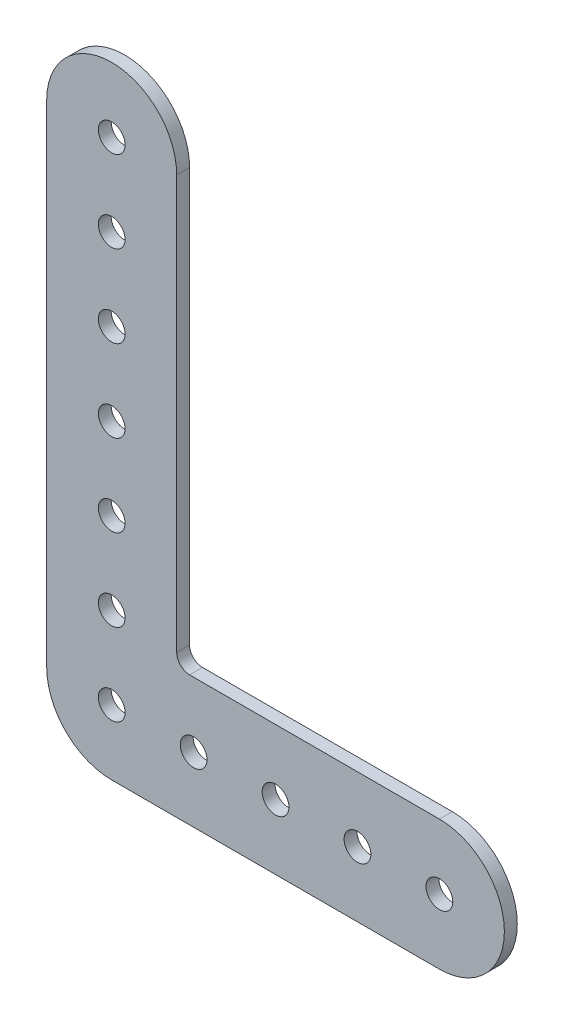
ISO-10303-21;
HEADER;
FILE_DESCRIPTION(('STEP AP214'),'2;1');
FILE_NAME('part.step','',(''),(''),'','','');
FILE_SCHEMA(('AUTOMOTIVE_DESIGN { 1 0 10303 214 1 1 1 1 }'));
ENDSEC;
DATA;
#1=APPLICATION_CONTEXT('core data for automotive mechanical design processes');
#2=APPLICATION_PROTOCOL_DEFINITION('international standard','automotive_design',2000,#1);
#3=PRODUCT_CONTEXT('',#1,'mechanical');
#4=PRODUCT('Part','Part','',(#3));
#5=PRODUCT_RELATED_PRODUCT_CATEGORY('part','',(#4));
#6=PRODUCT_DEFINITION_FORMATION('','',#4);
#7=PRODUCT_DEFINITION_CONTEXT('part definition',#1,'design');
#8=PRODUCT_DEFINITION('design','',#6,#7);
#9=PRODUCT_DEFINITION_SHAPE('','',#8);
#10=(LENGTH_UNIT() NAMED_UNIT(*) SI_UNIT(.MILLI.,.METRE.));
#11=(NAMED_UNIT(*) PLANE_ANGLE_UNIT() SI_UNIT($,.RADIAN.));
#12=(NAMED_UNIT(*) SI_UNIT($,.STERADIAN.) SOLID_ANGLE_UNIT());
#13=UNCERTAINTY_MEASURE_WITH_UNIT(LENGTH_MEASURE(1.E-05),#10,'distance_accuracy_value','');
#14=(GEOMETRIC_REPRESENTATION_CONTEXT(3) GLOBAL_UNCERTAINTY_ASSIGNED_CONTEXT((#13)) GLOBAL_UNIT_ASSIGNED_CONTEXT((#10,
#11,#12)) REPRESENTATION_CONTEXT('',''));
#15=CARTESIAN_POINT('',(0.,0.,0.));
#16=DIRECTION('',(0.,0.,1.));
#17=DIRECTION('',(1.,0.,0.));
#18=AXIS2_PLACEMENT_3D('',#15,#16,#17);
#19=CARTESIAN_POINT('',(-2.61384973715095E-13,76.2,1.));
#20=DIRECTION('',(0.,0.,1.));
#21=DIRECTION('',(1.,0.,0.));
#22=AXIS2_PLACEMENT_3D('',#19,#20,#21);
#23=PLANE('',#22);
#24=CARTESIAN_POINT('',(-2.17820811429246E-13,63.5,1.));
#25=DIRECTION('',(0.,0.,1.));
#26=DIRECTION('',(1.,0.,0.));
#27=AXIS2_PLACEMENT_3D('',#24,#25,#26);
#28=CIRCLE('',#27,2.075);
#29=CARTESIAN_POINT('',(2.07499999999978,63.5,1.));
#30=VERTEX_POINT('',#29);
#31=EDGE_CURVE('E216',#30,#30,#28,.T.);
#32=ORIENTED_EDGE('',*,*,#31,.F.);
#33=EDGE_LOOP('',(#32));
#34=FACE_BOUND('',#33,.T.);
#35=CARTESIAN_POINT('',(-1.30692486857548E-13,38.1,1.));
#36=DIRECTION('',(0.,0.,1.));
#37=DIRECTION('',(1.,0.,0.));
#38=AXIS2_PLACEMENT_3D('',#35,#36,#37);
#39=CIRCLE('',#38,2.075);
#40=CARTESIAN_POINT('',(2.07499999999987,38.1,1.));
#41=VERTEX_POINT('',#40);
#42=EDGE_CURVE('E204',#41,#41,#39,.T.);
#43=ORIENTED_EDGE('',*,*,#42,.F.);
#44=EDGE_LOOP('',(#43));
#45=FACE_BOUND('',#44,.T.);
#46=CARTESIAN_POINT('',(0.,12.7,1.));
#47=DIRECTION('',(0.,0.,1.));
#48=DIRECTION('',(1.,0.,0.));
#49=AXIS2_PLACEMENT_3D('',#46,#47,#48);
#50=CIRCLE('',#49,2.075);
#51=CARTESIAN_POINT('',(2.07499999999996,12.7,1.));
#52=VERTEX_POINT('',#51);
#53=EDGE_CURVE('E192',#52,#52,#50,.T.);
#54=ORIENTED_EDGE('',*,*,#53,.F.);
#55=EDGE_LOOP('',(#54));
#56=FACE_BOUND('',#55,.T.);
#57=CARTESIAN_POINT('',(38.1,0.,1.));
#58=DIRECTION('',(0.,0.,1.));
#59=DIRECTION('',(1.,0.,0.));
#60=AXIS2_PLACEMENT_3D('',#57,#58,#59);
#61=CIRCLE('',#60,2.075);
#62=CARTESIAN_POINT('',(40.175,0.,1.));
#63=VERTEX_POINT('',#62);
#64=EDGE_CURVE('E180',#63,#63,#61,.T.);
#65=ORIENTED_EDGE('',*,*,#64,.F.);
#66=EDGE_LOOP('',(#65));
#67=FACE_BOUND('',#66,.T.);
#68=CARTESIAN_POINT('',(12.7,0.,1.));
#69=DIRECTION('',(0.,0.,1.));
#70=DIRECTION('',(1.,0.,0.));
#71=AXIS2_PLACEMENT_3D('',#68,#69,#70);
#72=CIRCLE('',#71,2.075);
#73=CARTESIAN_POINT('',(14.775,0.,1.));
#74=VERTEX_POINT('',#73);
#75=EDGE_CURVE('E168',#74,#74,#72,.T.);
#76=ORIENTED_EDGE('',*,*,#75,.F.);
#77=EDGE_LOOP('',(#76));
#78=FACE_BOUND('',#77,.T.);
#79=CARTESIAN_POINT('',(-2.61384973715095E-13,76.2,1.));
#80=DIRECTION('',(0.,0.,1.));
#81=DIRECTION('',(1.,0.,0.));
#82=AXIS2_PLACEMENT_3D('',#79,#80,#81);
#83=CIRCLE('',#82,10.075);
#84=CARTESIAN_POINT('',(10.0749999999997,76.2,1.));
#85=VERTEX_POINT('',#84);
#86=CARTESIAN_POINT('',(-10.0750000000003,76.2,1.));
#87=VERTEX_POINT('',#86);
#88=EDGE_CURVE('E112',#85,#87,#83,.T.);
#89=ORIENTED_EDGE('',*,*,#88,.T.);
#90=DIRECTION('',(0.,-1.,0.));
#91=VECTOR('',#90,1.);
#92=CARTESIAN_POINT('',(-10.0750000000003,76.2,1.));
#93=LINE('',#92,#91);
#94=CARTESIAN_POINT('',(-10.075,0.,1.));
#95=VERTEX_POINT('',#94);
#96=EDGE_CURVE('E101',#87,#95,#93,.T.);
#97=ORIENTED_EDGE('',*,*,#96,.T.);
#98=CARTESIAN_POINT('',(0.,0.,1.));
#99=DIRECTION('',(0.,0.,1.));
#100=DIRECTION('',(1.,0.,0.));
#101=AXIS2_PLACEMENT_3D('',#98,#99,#100);
#102=CIRCLE('',#101,10.075);
#103=CARTESIAN_POINT('',(0.,-10.075,1.));
#104=VERTEX_POINT('',#103);
#105=EDGE_CURVE('E111',#95,#104,#102,.T.);
#106=ORIENTED_EDGE('',*,*,#105,.T.);
#107=DIRECTION('',(1.,0.,0.));
#108=VECTOR('',#107,1.);
#109=CARTESIAN_POINT('',(0.,-10.075,1.));
#110=LINE('',#109,#108);
#111=CARTESIAN_POINT('',(50.8,-10.075,1.));
#112=VERTEX_POINT('',#111);
#113=EDGE_CURVE('E162',#104,#112,#110,.T.);
#114=ORIENTED_EDGE('',*,*,#113,.T.);
#115=CARTESIAN_POINT('',(50.8,0.,1.));
#116=DIRECTION('',(0.,0.,1.));
#117=DIRECTION('',(1.,0.,0.));
#118=AXIS2_PLACEMENT_3D('',#115,#116,#117);
#119=CIRCLE('',#118,10.075);
#120=CARTESIAN_POINT('',(50.8,10.075,1.));
#121=VERTEX_POINT('',#120);
#122=EDGE_CURVE('E160',#112,#121,#119,.T.);
#123=ORIENTED_EDGE('',*,*,#122,.T.);
#124=DIRECTION('',(-1.,0.,0.));
#125=VECTOR('',#124,1.);
#126=CARTESIAN_POINT('',(50.8,10.075,1.));
#127=LINE('',#126,#125);
#128=CARTESIAN_POINT('',(12.075,10.075,1.));
#129=VERTEX_POINT('',#128);
#130=EDGE_CURVE('E158',#121,#129,#127,.T.);
#131=ORIENTED_EDGE('',*,*,#130,.T.);
#132=CARTESIAN_POINT('',(12.075,12.075,1.));
#133=DIRECTION('',(0.,0.,1.));
#134=DIRECTION('',(1.,0.,0.));
#135=AXIS2_PLACEMENT_3D('',#132,#133,#134);
#136=CIRCLE('',#135,2.);
#137=CARTESIAN_POINT('',(10.075,12.075,1.));
#138=VERTEX_POINT('',#137);
#139=EDGE_CURVE('E11',#129,#138,#136,.F.);
#140=ORIENTED_EDGE('',*,*,#139,.T.);
#141=DIRECTION('',(0.,1.,0.));
#142=VECTOR('',#141,1.);
#143=CARTESIAN_POINT('',(10.0749999999997,76.2,1.));
#144=LINE('',#143,#142);
#145=EDGE_CURVE('E117',#138,#85,#144,.T.);
#146=ORIENTED_EDGE('',*,*,#145,.T.);
#147=EDGE_LOOP('',(#89,#97,#106,#114,#123,#131,#140,#146));
#148=FACE_BOUND('',#147,.T.);
#149=CARTESIAN_POINT('',(0.,0.,1.));
#150=DIRECTION('',(0.,0.,1.));
#151=DIRECTION('',(1.,0.,0.));
#152=AXIS2_PLACEMENT_3D('',#149,#150,#151);
#153=CIRCLE('',#152,2.075);
#154=CARTESIAN_POINT('',(2.075,0.,1.));
#155=VERTEX_POINT('',#154);
#156=EDGE_CURVE('E156',#155,#155,#153,.T.);
#157=ORIENTED_EDGE('',*,*,#156,.F.);
#158=EDGE_LOOP('',(#157));
#159=FACE_BOUND('',#158,.T.);
#160=CARTESIAN_POINT('',(25.4,0.,1.));
#161=DIRECTION('',(0.,0.,1.));
#162=DIRECTION('',(1.,0.,0.));
#163=AXIS2_PLACEMENT_3D('',#160,#161,#162);
#164=CIRCLE('',#163,2.075);
#165=CARTESIAN_POINT('',(27.475,0.,1.));
#166=VERTEX_POINT('',#165);
#167=EDGE_CURVE('E174',#166,#166,#164,.T.);
#168=ORIENTED_EDGE('',*,*,#167,.F.);
#169=EDGE_LOOP('',(#168));
#170=FACE_BOUND('',#169,.T.);
#171=CARTESIAN_POINT('',(50.8,0.,1.));
#172=DIRECTION('',(0.,0.,1.));
#173=DIRECTION('',(1.,0.,0.));
#174=AXIS2_PLACEMENT_3D('',#171,#172,#173);
#175=CIRCLE('',#174,2.075);
#176=CARTESIAN_POINT('',(52.875,0.,1.));
#177=VERTEX_POINT('',#176);
#178=EDGE_CURVE('E186',#177,#177,#175,.T.);
#179=ORIENTED_EDGE('',*,*,#178,.F.);
#180=EDGE_LOOP('',(#179));
#181=FACE_BOUND('',#180,.T.);
#182=CARTESIAN_POINT('',(0.,25.4,1.));
#183=DIRECTION('',(0.,0.,1.));
#184=DIRECTION('',(1.,0.,0.));
#185=AXIS2_PLACEMENT_3D('',#182,#183,#184);
#186=CIRCLE('',#185,2.075);
#187=CARTESIAN_POINT('',(2.07499999999991,25.4,1.));
#188=VERTEX_POINT('',#187);
#189=EDGE_CURVE('E198',#188,#188,#186,.T.);
#190=ORIENTED_EDGE('',*,*,#189,.F.);
#191=EDGE_LOOP('',(#190));
#192=FACE_BOUND('',#191,.T.);
#193=CARTESIAN_POINT('',(-1.74256649143397E-13,50.8,1.));
#194=DIRECTION('',(0.,0.,1.));
#195=DIRECTION('',(1.,0.,0.));
#196=AXIS2_PLACEMENT_3D('',#193,#194,#195);
#197=CIRCLE('',#196,2.075);
#198=CARTESIAN_POINT('',(2.07499999999983,50.8,1.));
#199=VERTEX_POINT('',#198);
#200=EDGE_CURVE('E210',#199,#199,#197,.T.);
#201=ORIENTED_EDGE('',*,*,#200,.F.);
#202=EDGE_LOOP('',(#201));
#203=FACE_BOUND('',#202,.T.);
#204=CARTESIAN_POINT('',(-2.61384973715095E-13,76.2,1.));
#205=DIRECTION('',(0.,0.,1.));
#206=DIRECTION('',(1.,0.,0.));
#207=AXIS2_PLACEMENT_3D('',#204,#205,#206);
#208=CIRCLE('',#207,2.075);
#209=CARTESIAN_POINT('',(2.07499999999974,76.2,1.));
#210=VERTEX_POINT('',#209);
#211=EDGE_CURVE('E222',#210,#210,#208,.T.);
#212=ORIENTED_EDGE('',*,*,#211,.F.);
#213=EDGE_LOOP('',(#212));
#214=FACE_BOUND('',#213,.T.);
#215=ADVANCED_FACE('F36',(#34,#45,#56,#67,#78,#148,#159,#170,#181,#192,#203,#214),#23,.T.);
#216=CARTESIAN_POINT('',(-2.61384973715095E-13,76.2,-1.));
#217=DIRECTION('',(0.,0.,1.));
#218=DIRECTION('',(1.,0.,0.));
#219=AXIS2_PLACEMENT_3D('',#216,#217,#218);
#220=PLANE('',#219);
#221=CARTESIAN_POINT('',(-2.61384973715095E-13,76.2,-1.));
#222=DIRECTION('',(0.,0.,1.));
#223=DIRECTION('',(1.,0.,0.));
#224=AXIS2_PLACEMENT_3D('',#221,#222,#223);
#225=CIRCLE('',#224,10.075);
#226=CARTESIAN_POINT('',(10.0749999999997,76.2,-1.));
#227=VERTEX_POINT('',#226);
#228=CARTESIAN_POINT('',(-10.0750000000003,76.2,-1.));
#229=VERTEX_POINT('',#228);
#230=EDGE_CURVE('E125',#227,#229,#225,.T.);
#231=ORIENTED_EDGE('',*,*,#230,.F.);
#232=DIRECTION('',(0.,1.,0.));
#233=VECTOR('',#232,1.);
#234=CARTESIAN_POINT('',(10.0749999999997,76.2,-1.));
#235=LINE('',#234,#233);
#236=CARTESIAN_POINT('',(10.075,12.075,-1.));
#237=VERTEX_POINT('',#236);
#238=EDGE_CURVE('E121',#237,#227,#235,.T.);
#239=ORIENTED_EDGE('',*,*,#238,.F.);
#240=CARTESIAN_POINT('',(12.075,12.075,-1.));
#241=DIRECTION('',(0.,0.,1.));
#242=DIRECTION('',(1.,0.,0.));
#243=AXIS2_PLACEMENT_3D('',#240,#241,#242);
#244=CIRCLE('',#243,2.);
#245=CARTESIAN_POINT('',(12.075,10.075,-1.));
#246=VERTEX_POINT('',#245);
#247=EDGE_CURVE('E44',#237,#246,#244,.T.);
#248=ORIENTED_EDGE('',*,*,#247,.T.);
#249=DIRECTION('',(-1.,0.,0.));
#250=VECTOR('',#249,1.);
#251=CARTESIAN_POINT('',(50.8,10.075,-1.));
#252=LINE('',#251,#250);
#253=CARTESIAN_POINT('',(50.8,10.075,-1.));
#254=VERTEX_POINT('',#253);
#255=EDGE_CURVE('E145',#254,#246,#252,.T.);
#256=ORIENTED_EDGE('',*,*,#255,.F.);
#257=CARTESIAN_POINT('',(50.8,0.,-1.));
#258=DIRECTION('',(0.,0.,1.));
#259=DIRECTION('',(1.,0.,0.));
#260=AXIS2_PLACEMENT_3D('',#257,#258,#259);
#261=CIRCLE('',#260,10.075);
#262=CARTESIAN_POINT('',(50.8,-10.075,-1.));
#263=VERTEX_POINT('',#262);
#264=EDGE_CURVE('E147',#263,#254,#261,.T.);
#265=ORIENTED_EDGE('',*,*,#264,.F.);
#266=DIRECTION('',(1.,0.,0.));
#267=VECTOR('',#266,1.);
#268=CARTESIAN_POINT('',(0.,-10.075,-1.));
#269=LINE('',#268,#267);
#270=CARTESIAN_POINT('',(0.,-10.075,-1.));
#271=VERTEX_POINT('',#270);
#272=EDGE_CURVE('E149',#271,#263,#269,.T.);
#273=ORIENTED_EDGE('',*,*,#272,.F.);
#274=CARTESIAN_POINT('',(0.,0.,-1.));
#275=DIRECTION('',(0.,0.,1.));
#276=DIRECTION('',(1.,0.,0.));
#277=AXIS2_PLACEMENT_3D('',#274,#275,#276);
#278=CIRCLE('',#277,10.075);
#279=CARTESIAN_POINT('',(-10.075,0.,-1.));
#280=VERTEX_POINT('',#279);
#281=EDGE_CURVE('E151',#280,#271,#278,.T.);
#282=ORIENTED_EDGE('',*,*,#281,.F.);
#283=DIRECTION('',(0.,-1.,0.));
#284=VECTOR('',#283,1.);
#285=CARTESIAN_POINT('',(-10.0750000000003,76.2,-1.));
#286=LINE('',#285,#284);
#287=EDGE_CURVE('E153',#229,#280,#286,.T.);
#288=ORIENTED_EDGE('',*,*,#287,.F.);
#289=EDGE_LOOP('',(#231,#239,#248,#256,#265,#273,#282,#288));
#290=FACE_BOUND('',#289,.T.);
#291=CARTESIAN_POINT('',(0.,0.,-1.));
#292=DIRECTION('',(0.,0.,1.));
#293=DIRECTION('',(1.,0.,0.));
#294=AXIS2_PLACEMENT_3D('',#291,#292,#293);
#295=CIRCLE('',#294,2.075);
#296=CARTESIAN_POINT('',(2.075,0.,-1.));
#297=VERTEX_POINT('',#296);
#298=EDGE_CURVE('E165',#297,#297,#295,.T.);
#299=ORIENTED_EDGE('',*,*,#298,.T.);
#300=EDGE_LOOP('',(#299));
#301=FACE_BOUND('',#300,.T.);
#302=CARTESIAN_POINT('',(12.7,0.,-1.));
#303=DIRECTION('',(0.,0.,1.));
#304=DIRECTION('',(1.,0.,0.));
#305=AXIS2_PLACEMENT_3D('',#302,#303,#304);
#306=CIRCLE('',#305,2.075);
#307=CARTESIAN_POINT('',(14.775,0.,-1.));
#308=VERTEX_POINT('',#307);
#309=EDGE_CURVE('E171',#308,#308,#306,.T.);
#310=ORIENTED_EDGE('',*,*,#309,.T.);
#311=EDGE_LOOP('',(#310));
#312=FACE_BOUND('',#311,.T.);
#313=CARTESIAN_POINT('',(25.4,0.,-1.));
#314=DIRECTION('',(0.,0.,1.));
#315=DIRECTION('',(1.,0.,0.));
#316=AXIS2_PLACEMENT_3D('',#313,#314,#315);
#317=CIRCLE('',#316,2.075);
#318=CARTESIAN_POINT('',(27.475,0.,-1.));
#319=VERTEX_POINT('',#318);
#320=EDGE_CURVE('E177',#319,#319,#317,.T.);
#321=ORIENTED_EDGE('',*,*,#320,.T.);
#322=EDGE_LOOP('',(#321));
#323=FACE_BOUND('',#322,.T.);
#324=CARTESIAN_POINT('',(38.1,0.,-1.));
#325=DIRECTION('',(0.,0.,1.));
#326=DIRECTION('',(1.,0.,0.));
#327=AXIS2_PLACEMENT_3D('',#324,#325,#326);
#328=CIRCLE('',#327,2.075);
#329=CARTESIAN_POINT('',(40.175,0.,-1.));
#330=VERTEX_POINT('',#329);
#331=EDGE_CURVE('E183',#330,#330,#328,.T.);
#332=ORIENTED_EDGE('',*,*,#331,.T.);
#333=EDGE_LOOP('',(#332));
#334=FACE_BOUND('',#333,.T.);
#335=CARTESIAN_POINT('',(50.8,0.,-1.));
#336=DIRECTION('',(0.,0.,1.));
#337=DIRECTION('',(1.,0.,0.));
#338=AXIS2_PLACEMENT_3D('',#335,#336,#337);
#339=CIRCLE('',#338,2.075);
#340=CARTESIAN_POINT('',(52.875,0.,-1.));
#341=VERTEX_POINT('',#340);
#342=EDGE_CURVE('E189',#341,#341,#339,.T.);
#343=ORIENTED_EDGE('',*,*,#342,.T.);
#344=EDGE_LOOP('',(#343));
#345=FACE_BOUND('',#344,.T.);
#346=CARTESIAN_POINT('',(0.,12.7,-1.));
#347=DIRECTION('',(0.,0.,1.));
#348=DIRECTION('',(1.,0.,0.));
#349=AXIS2_PLACEMENT_3D('',#346,#347,#348);
#350=CIRCLE('',#349,2.075);
#351=CARTESIAN_POINT('',(2.07499999999996,12.7,-1.));
#352=VERTEX_POINT('',#351);
#353=EDGE_CURVE('E195',#352,#352,#350,.T.);
#354=ORIENTED_EDGE('',*,*,#353,.T.);
#355=EDGE_LOOP('',(#354));
#356=FACE_BOUND('',#355,.T.);
#357=CARTESIAN_POINT('',(0.,25.4,-1.));
#358=DIRECTION('',(0.,0.,1.));
#359=DIRECTION('',(1.,0.,0.));
#360=AXIS2_PLACEMENT_3D('',#357,#358,#359);
#361=CIRCLE('',#360,2.075);
#362=CARTESIAN_POINT('',(2.07499999999991,25.4,-1.));
#363=VERTEX_POINT('',#362);
#364=EDGE_CURVE('E201',#363,#363,#361,.T.);
#365=ORIENTED_EDGE('',*,*,#364,.T.);
#366=EDGE_LOOP('',(#365));
#367=FACE_BOUND('',#366,.T.);
#368=CARTESIAN_POINT('',(-1.30692486857548E-13,38.1,-1.));
#369=DIRECTION('',(0.,0.,1.));
#370=DIRECTION('',(1.,0.,0.));
#371=AXIS2_PLACEMENT_3D('',#368,#369,#370);
#372=CIRCLE('',#371,2.075);
#373=CARTESIAN_POINT('',(2.07499999999987,38.1,-1.));
#374=VERTEX_POINT('',#373);
#375=EDGE_CURVE('E207',#374,#374,#372,.T.);
#376=ORIENTED_EDGE('',*,*,#375,.T.);
#377=EDGE_LOOP('',(#376));
#378=FACE_BOUND('',#377,.T.);
#379=CARTESIAN_POINT('',(-1.74256649143397E-13,50.8,-1.));
#380=DIRECTION('',(0.,0.,1.));
#381=DIRECTION('',(1.,0.,0.));
#382=AXIS2_PLACEMENT_3D('',#379,#380,#381);
#383=CIRCLE('',#382,2.075);
#384=CARTESIAN_POINT('',(2.07499999999983,50.8,-1.));
#385=VERTEX_POINT('',#384);
#386=EDGE_CURVE('E213',#385,#385,#383,.T.);
#387=ORIENTED_EDGE('',*,*,#386,.T.);
#388=EDGE_LOOP('',(#387));
#389=FACE_BOUND('',#388,.T.);
#390=CARTESIAN_POINT('',(-2.17820811429246E-13,63.5,-1.));
#391=DIRECTION('',(0.,0.,1.));
#392=DIRECTION('',(1.,0.,0.));
#393=AXIS2_PLACEMENT_3D('',#390,#391,#392);
#394=CIRCLE('',#393,2.075);
#395=CARTESIAN_POINT('',(2.07499999999978,63.5,-1.));
#396=VERTEX_POINT('',#395);
#397=EDGE_CURVE('E219',#396,#396,#394,.T.);
#398=ORIENTED_EDGE('',*,*,#397,.T.);
#399=EDGE_LOOP('',(#398));
#400=FACE_BOUND('',#399,.T.);
#401=CARTESIAN_POINT('',(-2.61384973715095E-13,76.2,-1.));
#402=DIRECTION('',(0.,0.,1.));
#403=DIRECTION('',(1.,0.,0.));
#404=AXIS2_PLACEMENT_3D('',#401,#402,#403);
#405=CIRCLE('',#404,2.075);
#406=CARTESIAN_POINT('',(2.07499999999974,76.2,-1.));
#407=VERTEX_POINT('',#406);
#408=EDGE_CURVE('E225',#407,#407,#405,.T.);
#409=ORIENTED_EDGE('',*,*,#408,.T.);
#410=EDGE_LOOP('',(#409));
#411=FACE_BOUND('',#410,.T.);
#412=ADVANCED_FACE('F235',(#290,#301,#312,#323,#334,#345,#356,#367,#378,#389,#400,#411),#220,.F.);
#413=CARTESIAN_POINT('',(-2.61384973715095E-13,76.2,1.));
#414=DIRECTION('',(0.,0.,-1.));
#415=DIRECTION('',(-1.,0.,0.));
#416=AXIS2_PLACEMENT_3D('',#413,#414,#415);
#417=CYLINDRICAL_SURFACE('',#416,10.075);
#418=ORIENTED_EDGE('',*,*,#230,.T.);
#419=DIRECTION('',(0.,0.,-1.));
#420=VECTOR('',#419,1.);
#421=CARTESIAN_POINT('',(-10.0750000000003,76.2,1.));
#422=LINE('',#421,#420);
#423=EDGE_CURVE('E105',#87,#229,#422,.T.);
#424=ORIENTED_EDGE('',*,*,#423,.F.);
#425=ORIENTED_EDGE('',*,*,#88,.F.);
#426=DIRECTION('',(0.,0.,-1.));
#427=VECTOR('',#426,1.);
#428=CARTESIAN_POINT('',(10.0749999999997,76.2,1.));
#429=LINE('',#428,#427);
#430=EDGE_CURVE('E142',#85,#227,#429,.T.);
#431=ORIENTED_EDGE('',*,*,#430,.T.);
#432=EDGE_LOOP('',(#418,#424,#425,#431));
#433=FACE_BOUND('',#432,.T.);
#434=ADVANCED_FACE('F123',(#433),#417,.T.);
#435=CARTESIAN_POINT('',(-10.0750000000003,76.2,1.));
#436=DIRECTION('',(1.,0.,0.));
#437=DIRECTION('',(0.,1.,0.));
#438=AXIS2_PLACEMENT_3D('',#435,#436,#437);
#439=PLANE('',#438);
#440=ORIENTED_EDGE('',*,*,#287,.T.);
#441=DIRECTION('',(0.,0.,-1.));
#442=VECTOR('',#441,1.);
#443=CARTESIAN_POINT('',(-10.075,0.,1.));
#444=LINE('',#443,#442);
#445=EDGE_CURVE('E108',#95,#280,#444,.T.);
#446=ORIENTED_EDGE('',*,*,#445,.F.);
#447=ORIENTED_EDGE('',*,*,#96,.F.);
#448=ORIENTED_EDGE('',*,*,#423,.T.);
#449=EDGE_LOOP('',(#440,#446,#447,#448));
#450=FACE_BOUND('',#449,.T.);
#451=ADVANCED_FACE('F103',(#450),#439,.F.);
#452=CARTESIAN_POINT('',(0.,0.,1.));
#453=DIRECTION('',(0.,0.,-1.));
#454=DIRECTION('',(-1.,0.,0.));
#455=AXIS2_PLACEMENT_3D('',#452,#453,#454);
#456=CYLINDRICAL_SURFACE('',#455,10.075);
#457=ORIENTED_EDGE('',*,*,#281,.T.);
#458=DIRECTION('',(0.,0.,-1.));
#459=VECTOR('',#458,1.);
#460=CARTESIAN_POINT('',(0.,-10.075,1.));
#461=LINE('',#460,#459);
#462=EDGE_CURVE('E130',#104,#271,#461,.T.);
#463=ORIENTED_EDGE('',*,*,#462,.F.);
#464=ORIENTED_EDGE('',*,*,#105,.F.);
#465=ORIENTED_EDGE('',*,*,#445,.T.);
#466=EDGE_LOOP('',(#457,#463,#464,#465));
#467=FACE_BOUND('',#466,.T.);
#468=ADVANCED_FACE('F262',(#467),#456,.T.);
#469=CARTESIAN_POINT('',(0.,-10.075,1.));
#470=DIRECTION('',(0.,1.,0.));
#471=DIRECTION('',(0.,0.,1.));
#472=AXIS2_PLACEMENT_3D('',#469,#470,#471);
#473=PLANE('',#472);
#474=ORIENTED_EDGE('',*,*,#272,.T.);
#475=DIRECTION('',(0.,0.,-1.));
#476=VECTOR('',#475,1.);
#477=CARTESIAN_POINT('',(50.8,-10.075,1.));
#478=LINE('',#477,#476);
#479=EDGE_CURVE('E136',#112,#263,#478,.T.);
#480=ORIENTED_EDGE('',*,*,#479,.F.);
#481=ORIENTED_EDGE('',*,*,#113,.F.);
#482=ORIENTED_EDGE('',*,*,#462,.T.);
#483=EDGE_LOOP('',(#474,#480,#481,#482));
#484=FACE_BOUND('',#483,.T.);
#485=ADVANCED_FACE('F258',(#484),#473,.F.);
#486=CARTESIAN_POINT('',(50.8,0.,1.));
#487=DIRECTION('',(0.,0.,-1.));
#488=DIRECTION('',(-1.,0.,0.));
#489=AXIS2_PLACEMENT_3D('',#486,#487,#488);
#490=CYLINDRICAL_SURFACE('',#489,10.075);
#491=ORIENTED_EDGE('',*,*,#264,.T.);
#492=DIRECTION('',(0.,0.,-1.));
#493=VECTOR('',#492,1.);
#494=CARTESIAN_POINT('',(50.8,10.075,1.));
#495=LINE('',#494,#493);
#496=EDGE_CURVE('E139',#121,#254,#495,.T.);
#497=ORIENTED_EDGE('',*,*,#496,.F.);
#498=ORIENTED_EDGE('',*,*,#122,.F.);
#499=ORIENTED_EDGE('',*,*,#479,.T.);
#500=EDGE_LOOP('',(#491,#497,#498,#499));
#501=FACE_BOUND('',#500,.T.);
#502=ADVANCED_FACE('F255',(#501),#490,.T.);
#503=CARTESIAN_POINT('',(50.8,10.075,1.));
#504=DIRECTION('',(0.,-1.,0.));
#505=DIRECTION('',(0.,0.,-1.));
#506=AXIS2_PLACEMENT_3D('',#503,#504,#505);
#507=PLANE('',#506);
#508=ORIENTED_EDGE('',*,*,#255,.T.);
#509=DIRECTION('',(0.,0.,-1.));
#510=VECTOR('',#509,1.);
#511=CARTESIAN_POINT('',(12.075,10.075,1.));
#512=LINE('',#511,#510);
#513=EDGE_CURVE('E51',#246,#129,#512,.F.);
#514=ORIENTED_EDGE('',*,*,#513,.T.);
#515=ORIENTED_EDGE('',*,*,#130,.F.);
#516=ORIENTED_EDGE('',*,*,#496,.T.);
#517=EDGE_LOOP('',(#508,#514,#515,#516));
#518=FACE_BOUND('',#517,.T.);
#519=ADVANCED_FACE('F251',(#518),#507,.F.);
#520=CARTESIAN_POINT('',(10.0749999999997,76.2,1.));
#521=DIRECTION('',(-1.,0.,0.));
#522=DIRECTION('',(0.,-1.,0.));
#523=AXIS2_PLACEMENT_3D('',#520,#521,#522);
#524=PLANE('',#523);
#525=ORIENTED_EDGE('',*,*,#145,.F.);
#526=DIRECTION('',(0.,0.,-1.));
#527=VECTOR('',#526,1.);
#528=CARTESIAN_POINT('',(10.075,12.075,-1.));
#529=LINE('',#528,#527);
#530=EDGE_CURVE('E126',#138,#237,#529,.T.);
#531=ORIENTED_EDGE('',*,*,#530,.T.);
#532=ORIENTED_EDGE('',*,*,#238,.T.);
#533=ORIENTED_EDGE('',*,*,#430,.F.);
#534=EDGE_LOOP('',(#525,#531,#532,#533));
#535=FACE_BOUND('',#534,.T.);
#536=ADVANCED_FACE('F248',(#535),#524,.F.);
#537=CARTESIAN_POINT('',(0.,0.,1.));
#538=DIRECTION('',(0.,0.,-1.));
#539=DIRECTION('',(-1.,0.,0.));
#540=AXIS2_PLACEMENT_3D('',#537,#538,#539);
#541=CYLINDRICAL_SURFACE('',#540,2.075);
#542=ORIENTED_EDGE('',*,*,#156,.T.);
#543=EDGE_LOOP('',(#542));
#544=FACE_BOUND('',#543,.T.);
#545=ORIENTED_EDGE('',*,*,#298,.F.);
#546=EDGE_LOOP('',(#545));
#547=FACE_BOUND('',#546,.T.);
#548=ADVANCED_FACE('F245',(#544,#547),#541,.F.);
#549=CARTESIAN_POINT('',(12.7,0.,1.));
#550=DIRECTION('',(0.,0.,-1.));
#551=DIRECTION('',(-1.,0.,0.));
#552=AXIS2_PLACEMENT_3D('',#549,#550,#551);
#553=CYLINDRICAL_SURFACE('',#552,2.075);
#554=ORIENTED_EDGE('',*,*,#75,.T.);
#555=EDGE_LOOP('',(#554));
#556=FACE_BOUND('',#555,.T.);
#557=ORIENTED_EDGE('',*,*,#309,.F.);
#558=EDGE_LOOP('',(#557));
#559=FACE_BOUND('',#558,.T.);
#560=ADVANCED_FACE('F304',(#556,#559),#553,.F.);
#561=CARTESIAN_POINT('',(25.4,0.,1.));
#562=DIRECTION('',(0.,0.,-1.));
#563=DIRECTION('',(-1.,0.,0.));
#564=AXIS2_PLACEMENT_3D('',#561,#562,#563);
#565=CYLINDRICAL_SURFACE('',#564,2.075);
#566=ORIENTED_EDGE('',*,*,#167,.T.);
#567=EDGE_LOOP('',(#566));
#568=FACE_BOUND('',#567,.T.);
#569=ORIENTED_EDGE('',*,*,#320,.F.);
#570=EDGE_LOOP('',(#569));
#571=FACE_BOUND('',#570,.T.);
#572=ADVANCED_FACE('F311',(#568,#571),#565,.F.);
#573=CARTESIAN_POINT('',(38.1,0.,1.));
#574=DIRECTION('',(0.,0.,-1.));
#575=DIRECTION('',(-1.,0.,0.));
#576=AXIS2_PLACEMENT_3D('',#573,#574,#575);
#577=CYLINDRICAL_SURFACE('',#576,2.075);
#578=ORIENTED_EDGE('',*,*,#64,.T.);
#579=EDGE_LOOP('',(#578));
#580=FACE_BOUND('',#579,.T.);
#581=ORIENTED_EDGE('',*,*,#331,.F.);
#582=EDGE_LOOP('',(#581));
#583=FACE_BOUND('',#582,.T.);
#584=ADVANCED_FACE('F318',(#580,#583),#577,.F.);
#585=CARTESIAN_POINT('',(50.8,0.,1.));
#586=DIRECTION('',(0.,0.,-1.));
#587=DIRECTION('',(-1.,0.,0.));
#588=AXIS2_PLACEMENT_3D('',#585,#586,#587);
#589=CYLINDRICAL_SURFACE('',#588,2.075);
#590=ORIENTED_EDGE('',*,*,#178,.T.);
#591=EDGE_LOOP('',(#590));
#592=FACE_BOUND('',#591,.T.);
#593=ORIENTED_EDGE('',*,*,#342,.F.);
#594=EDGE_LOOP('',(#593));
#595=FACE_BOUND('',#594,.T.);
#596=ADVANCED_FACE('F326',(#592,#595),#589,.F.);
#597=CARTESIAN_POINT('',(0.,12.7,1.));
#598=DIRECTION('',(0.,0.,-1.));
#599=DIRECTION('',(-1.,0.,0.));
#600=AXIS2_PLACEMENT_3D('',#597,#598,#599);
#601=CYLINDRICAL_SURFACE('',#600,2.075);
#602=ORIENTED_EDGE('',*,*,#53,.T.);
#603=EDGE_LOOP('',(#602));
#604=FACE_BOUND('',#603,.T.);
#605=ORIENTED_EDGE('',*,*,#353,.F.);
#606=EDGE_LOOP('',(#605));
#607=FACE_BOUND('',#606,.T.);
#608=ADVANCED_FACE('F334',(#604,#607),#601,.F.);
#609=CARTESIAN_POINT('',(0.,25.4,1.));
#610=DIRECTION('',(0.,0.,-1.));
#611=DIRECTION('',(-1.,0.,0.));
#612=AXIS2_PLACEMENT_3D('',#609,#610,#611);
#613=CYLINDRICAL_SURFACE('',#612,2.075);
#614=ORIENTED_EDGE('',*,*,#189,.T.);
#615=EDGE_LOOP('',(#614));
#616=FACE_BOUND('',#615,.T.);
#617=ORIENTED_EDGE('',*,*,#364,.F.);
#618=EDGE_LOOP('',(#617));
#619=FACE_BOUND('',#618,.T.);
#620=ADVANCED_FACE('F342',(#616,#619),#613,.F.);
#621=CARTESIAN_POINT('',(-1.30692486857548E-13,38.1,1.));
#622=DIRECTION('',(0.,0.,-1.));
#623=DIRECTION('',(-1.,0.,0.));
#624=AXIS2_PLACEMENT_3D('',#621,#622,#623);
#625=CYLINDRICAL_SURFACE('',#624,2.075);
#626=ORIENTED_EDGE('',*,*,#42,.T.);
#627=EDGE_LOOP('',(#626));
#628=FACE_BOUND('',#627,.T.);
#629=ORIENTED_EDGE('',*,*,#375,.F.);
#630=EDGE_LOOP('',(#629));
#631=FACE_BOUND('',#630,.T.);
#632=ADVANCED_FACE('F350',(#628,#631),#625,.F.);
#633=CARTESIAN_POINT('',(-1.74256649143397E-13,50.8,1.));
#634=DIRECTION('',(0.,0.,-1.));
#635=DIRECTION('',(-1.,0.,0.));
#636=AXIS2_PLACEMENT_3D('',#633,#634,#635);
#637=CYLINDRICAL_SURFACE('',#636,2.075);
#638=ORIENTED_EDGE('',*,*,#200,.T.);
#639=EDGE_LOOP('',(#638));
#640=FACE_BOUND('',#639,.T.);
#641=ORIENTED_EDGE('',*,*,#386,.F.);
#642=EDGE_LOOP('',(#641));
#643=FACE_BOUND('',#642,.T.);
#644=ADVANCED_FACE('F358',(#640,#643),#637,.F.);
#645=CARTESIAN_POINT('',(-2.17820811429246E-13,63.5,1.));
#646=DIRECTION('',(0.,0.,-1.));
#647=DIRECTION('',(-1.,0.,0.));
#648=AXIS2_PLACEMENT_3D('',#645,#646,#647);
#649=CYLINDRICAL_SURFACE('',#648,2.075);
#650=ORIENTED_EDGE('',*,*,#31,.T.);
#651=EDGE_LOOP('',(#650));
#652=FACE_BOUND('',#651,.T.);
#653=ORIENTED_EDGE('',*,*,#397,.F.);
#654=EDGE_LOOP('',(#653));
#655=FACE_BOUND('',#654,.T.);
#656=ADVANCED_FACE('F366',(#652,#655),#649,.F.);
#657=CARTESIAN_POINT('',(-2.61384973715095E-13,76.2,1.));
#658=DIRECTION('',(0.,0.,-1.));
#659=DIRECTION('',(-1.,0.,0.));
#660=AXIS2_PLACEMENT_3D('',#657,#658,#659);
#661=CYLINDRICAL_SURFACE('',#660,2.075);
#662=ORIENTED_EDGE('',*,*,#211,.T.);
#663=EDGE_LOOP('',(#662));
#664=FACE_BOUND('',#663,.T.);
#665=ORIENTED_EDGE('',*,*,#408,.F.);
#666=EDGE_LOOP('',(#665));
#667=FACE_BOUND('',#666,.T.);
#668=ADVANCED_FACE('F231',(#664,#667),#661,.F.);
#669=CARTESIAN_POINT('',(12.075,12.075,1.));
#670=DIRECTION('',(0.,0.,1.));
#671=DIRECTION('',(1.,0.,0.));
#672=AXIS2_PLACEMENT_3D('',#669,#670,#671);
#673=CYLINDRICAL_SURFACE('',#672,2.);
#674=ORIENTED_EDGE('',*,*,#139,.F.);
#675=ORIENTED_EDGE('',*,*,#513,.F.);
#676=ORIENTED_EDGE('',*,*,#247,.F.);
#677=ORIENTED_EDGE('',*,*,#530,.F.);
#678=EDGE_LOOP('',(#674,#675,#676,#677));
#679=FACE_BOUND('',#678,.T.);
#680=ADVANCED_FACE('F38',(#679),#673,.F.);
#681=CLOSED_SHELL('',(#215,#412,#434,#451,#468,#485,#502,#519,#536,#548,#560,#572,#584,#596,
#608,#620,#632,#644,#656,#668,#680));
#682=MANIFOLD_SOLID_BREP('B2',#681);
#683=ADVANCED_BREP_SHAPE_REPRESENTATION('',(#18,#682),#14);
#684=SHAPE_DEFINITION_REPRESENTATION(#9,#683);
ENDSEC;
END-ISO-10303-21;
